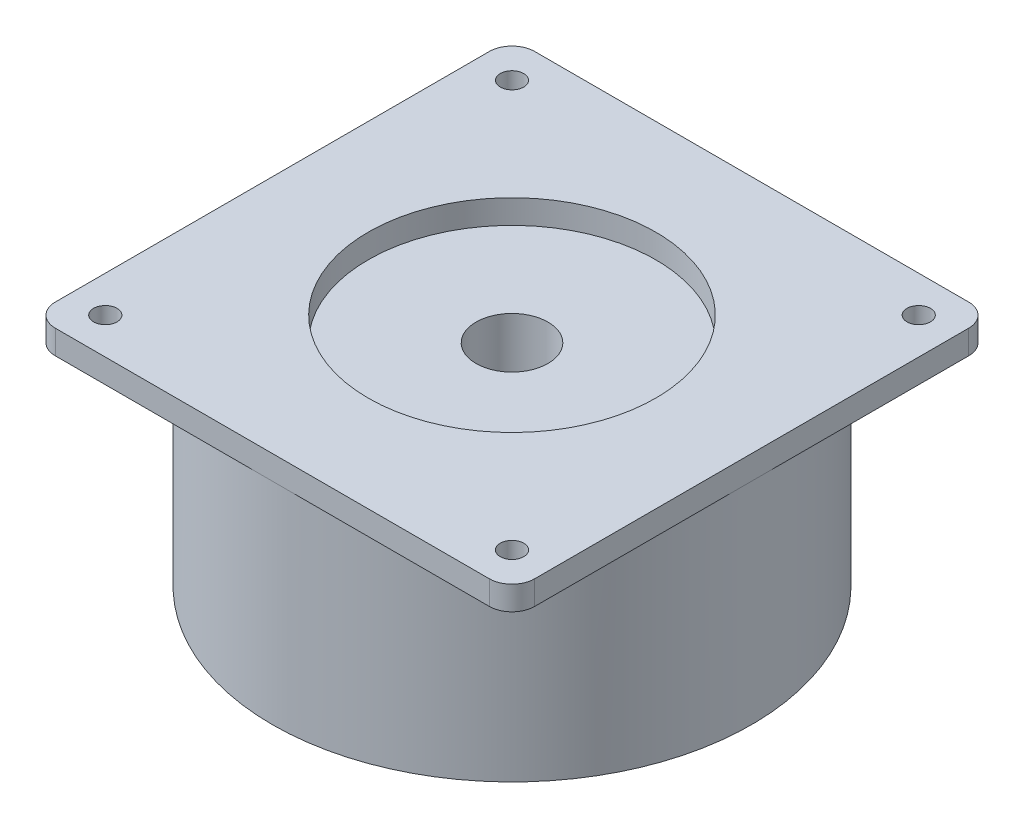
ISO-10303-21;
HEADER;
FILE_DESCRIPTION(('STEP AP214'),'2;1');
FILE_NAME('part.step','',(''),(''),'','','');
FILE_SCHEMA(('AUTOMOTIVE_DESIGN { 1 0 10303 214 1 1 1 1 }'));
ENDSEC;
DATA;
#1=APPLICATION_CONTEXT('core data for automotive mechanical design processes');
#2=APPLICATION_PROTOCOL_DEFINITION('international standard','automotive_design',2000,#1);
#3=PRODUCT_CONTEXT('',#1,'mechanical');
#4=PRODUCT('Part','Part','',(#3));
#5=PRODUCT_RELATED_PRODUCT_CATEGORY('part','',(#4));
#6=PRODUCT_DEFINITION_FORMATION('','',#4);
#7=PRODUCT_DEFINITION_CONTEXT('part definition',#1,'design');
#8=PRODUCT_DEFINITION('design','',#6,#7);
#9=PRODUCT_DEFINITION_SHAPE('','',#8);
#10=(LENGTH_UNIT() NAMED_UNIT(*) SI_UNIT(.MILLI.,.METRE.));
#11=(NAMED_UNIT(*) PLANE_ANGLE_UNIT() SI_UNIT($,.RADIAN.));
#12=(NAMED_UNIT(*) SI_UNIT($,.STERADIAN.) SOLID_ANGLE_UNIT());
#13=UNCERTAINTY_MEASURE_WITH_UNIT(LENGTH_MEASURE(1.E-05),#10,'distance_accuracy_value','');
#14=(GEOMETRIC_REPRESENTATION_CONTEXT(3) GLOBAL_UNCERTAINTY_ASSIGNED_CONTEXT((#13)) GLOBAL_UNIT_ASSIGNED_CONTEXT((#10,
#11,#12)) REPRESENTATION_CONTEXT('',''));
#15=CARTESIAN_POINT('',(0.,0.,0.));
#16=DIRECTION('',(0.,0.,1.));
#17=DIRECTION('',(1.,0.,0.));
#18=AXIS2_PLACEMENT_3D('',#15,#16,#17);
#19=CARTESIAN_POINT('',(0.,0.,0.));
#20=DIRECTION('',(0.,1.,0.));
#21=DIRECTION('',(0.,0.,1.));
#22=AXIS2_PLACEMENT_3D('',#19,#20,#21);
#23=PLANE('',#22);
#24=CARTESIAN_POINT('',(0.,0.,0.));
#25=DIRECTION('',(0.,1.,0.));
#26=DIRECTION('',(0.,0.,1.));
#27=AXIS2_PLACEMENT_3D('',#24,#25,#26);
#28=CIRCLE('',#27,31.75);
#29=CARTESIAN_POINT('',(0.,0.,31.75));
#30=VERTEX_POINT('',#29);
#31=EDGE_CURVE('E36',#30,#30,#28,.T.);
#32=ORIENTED_EDGE('',*,*,#31,.F.);
#33=EDGE_LOOP('',(#32));
#34=FACE_BOUND('',#33,.T.);
#35=CARTESIAN_POINT('',(0.,0.,0.));
#36=DIRECTION('',(0.,1.,0.));
#37=DIRECTION('',(0.,0.,1.));
#38=AXIS2_PLACEMENT_3D('',#35,#36,#37);
#39=CIRCLE('',#38,4.7625);
#40=CARTESIAN_POINT('',(0.,0.,4.7625));
#41=VERTEX_POINT('',#40);
#42=EDGE_CURVE('E135',#41,#41,#39,.T.);
#43=ORIENTED_EDGE('',*,*,#42,.T.);
#44=EDGE_LOOP('',(#43));
#45=FACE_BOUND('',#44,.T.);
#46=ADVANCED_FACE('F32',(#34,#45),#23,.F.);
#47=CARTESIAN_POINT('',(0.,27.94,0.));
#48=DIRECTION('',(0.,-1.,0.));
#49=DIRECTION('',(0.,0.,-1.));
#50=AXIS2_PLACEMENT_3D('',#47,#48,#49);
#51=CYLINDRICAL_SURFACE('',#50,31.75);
#52=CARTESIAN_POINT('',(0.,27.94,0.));
#53=DIRECTION('',(0.,1.,0.));
#54=DIRECTION('',(0.,0.,1.));
#55=AXIS2_PLACEMENT_3D('',#52,#53,#54);
#56=CIRCLE('',#55,31.75);
#57=CARTESIAN_POINT('',(0.,27.94,31.75));
#58=VERTEX_POINT('',#57);
#59=CARTESIAN_POINT('',(31.75,27.94,0.));
#60=VERTEX_POINT('',#59);
#61=EDGE_CURVE('E11',#58,#60,#56,.T.);
#62=ORIENTED_EDGE('',*,*,#61,.F.);
#63=CARTESIAN_POINT('',(-31.75,27.94,0.));
#64=VERTEX_POINT('',#63);
#65=EDGE_CURVE('E42',#64,#58,#56,.T.);
#66=ORIENTED_EDGE('',*,*,#65,.F.);
#67=CARTESIAN_POINT('',(0.,27.94,-31.75));
#68=VERTEX_POINT('',#67);
#69=EDGE_CURVE('E52',#68,#64,#56,.T.);
#70=ORIENTED_EDGE('',*,*,#69,.F.);
#71=EDGE_CURVE('E41',#60,#68,#56,.T.);
#72=ORIENTED_EDGE('',*,*,#71,.F.);
#73=EDGE_LOOP('',(#62,#66,#70,#72));
#74=FACE_BOUND('',#73,.T.);
#75=ORIENTED_EDGE('',*,*,#31,.T.);
#76=EDGE_LOOP('',(#75));
#77=FACE_BOUND('',#76,.T.);
#78=ADVANCED_FACE('F34',(#74,#77),#51,.T.);
#79=CARTESIAN_POINT('',(0.,27.94,0.));
#80=DIRECTION('',(0.,-1.,0.));
#81=DIRECTION('',(0.,0.,-1.));
#82=AXIS2_PLACEMENT_3D('',#79,#80,#81);
#83=CYLINDRICAL_SURFACE('',#82,4.7625);
#84=CARTESIAN_POINT('',(0.,27.94,0.));
#85=DIRECTION('',(0.,1.,0.));
#86=DIRECTION('',(0.,0.,1.));
#87=AXIS2_PLACEMENT_3D('',#84,#85,#86);
#88=CIRCLE('',#87,4.7625);
#89=CARTESIAN_POINT('',(0.,27.94,4.7625));
#90=VERTEX_POINT('',#89);
#91=EDGE_CURVE('E211',#90,#90,#88,.T.);
#92=ORIENTED_EDGE('',*,*,#91,.T.);
#93=EDGE_LOOP('',(#92));
#94=FACE_BOUND('',#93,.T.);
#95=ORIENTED_EDGE('',*,*,#42,.F.);
#96=EDGE_LOOP('',(#95));
#97=FACE_BOUND('',#96,.T.);
#98=ADVANCED_FACE('F276',(#94,#97),#83,.F.);
#99=CARTESIAN_POINT('',(-28.75,27.94,28.75));
#100=DIRECTION('',(0.,1.,0.));
#101=DIRECTION('',(0.,0.,1.));
#102=AXIS2_PLACEMENT_3D('',#99,#100,#101);
#103=PLANE('',#102);
#104=CARTESIAN_POINT('',(26.940768363209,27.94,26.9407683632059));
#105=DIRECTION('',(0.,1.,0.));
#106=DIRECTION('',(0.,0.,1.));
#107=AXIS2_PLACEMENT_3D('',#104,#105,#106);
#108=CIRCLE('',#107,1.55575000000216);
#109=CARTESIAN_POINT('',(26.940768363209,27.94,28.4965183632081));
#110=VERTEX_POINT('',#109);
#111=EDGE_CURVE('E202',#110,#110,#108,.T.);
#112=ORIENTED_EDGE('',*,*,#111,.T.);
#113=EDGE_LOOP('',(#112));
#114=FACE_BOUND('',#113,.T.);
#115=DIRECTION('',(1.,0.,0.));
#116=VECTOR('',#115,1.);
#117=CARTESIAN_POINT('',(-28.75,27.94,31.75));
#118=LINE('',#117,#116);
#119=CARTESIAN_POINT('',(28.75,27.94,31.75));
#120=VERTEX_POINT('',#119);
#121=EDGE_CURVE('E177',#58,#120,#118,.T.);
#122=ORIENTED_EDGE('',*,*,#121,.F.);
#123=ORIENTED_EDGE('',*,*,#61,.T.);
#124=DIRECTION('',(0.,0.,-1.));
#125=VECTOR('',#124,1.);
#126=CARTESIAN_POINT('',(31.75,27.94,-28.75));
#127=LINE('',#126,#125);
#128=CARTESIAN_POINT('',(31.75,27.94,28.75));
#129=VERTEX_POINT('',#128);
#130=EDGE_CURVE('E169',#129,#60,#127,.T.);
#131=ORIENTED_EDGE('',*,*,#130,.F.);
#132=CARTESIAN_POINT('',(28.75,27.94,28.75));
#133=DIRECTION('',(0.,1.,0.));
#134=DIRECTION('',(0.,0.,1.));
#135=AXIS2_PLACEMENT_3D('',#132,#133,#134);
#136=CIRCLE('',#135,3.);
#137=EDGE_CURVE('E173',#120,#129,#136,.T.);
#138=ORIENTED_EDGE('',*,*,#137,.F.);
#139=EDGE_LOOP('',(#122,#123,#131,#138));
#140=FACE_BOUND('',#139,.T.);
#141=ADVANCED_FACE('F278',(#114,#140),#103,.F.);
#142=CARTESIAN_POINT('',(26.9407683632074,27.94,-26.940768363209));
#143=DIRECTION('',(0.,1.,0.));
#144=DIRECTION('',(0.,0.,1.));
#145=AXIS2_PLACEMENT_3D('',#142,#143,#144);
#146=CIRCLE('',#145,1.55575000000159);
#147=CARTESIAN_POINT('',(26.9407683632074,27.94,-25.3850183632074));
#148=VERTEX_POINT('',#147);
#149=EDGE_CURVE('E196',#148,#148,#146,.T.);
#150=ORIENTED_EDGE('',*,*,#149,.T.);
#151=EDGE_LOOP('',(#150));
#152=FACE_BOUND('',#151,.T.);
#153=CARTESIAN_POINT('',(31.75,27.94,-28.75));
#154=VERTEX_POINT('',#153);
#155=EDGE_CURVE('E172',#60,#154,#127,.T.);
#156=ORIENTED_EDGE('',*,*,#155,.F.);
#157=ORIENTED_EDGE('',*,*,#71,.T.);
#158=DIRECTION('',(-1.,0.,0.));
#159=VECTOR('',#158,1.);
#160=CARTESIAN_POINT('',(-28.75,27.94,-31.75));
#161=LINE('',#160,#159);
#162=CARTESIAN_POINT('',(28.75,27.94,-31.75));
#163=VERTEX_POINT('',#162);
#164=EDGE_CURVE('E163',#163,#68,#161,.T.);
#165=ORIENTED_EDGE('',*,*,#164,.F.);
#166=CARTESIAN_POINT('',(28.75,27.94,-28.75));
#167=DIRECTION('',(0.,1.,0.));
#168=DIRECTION('',(0.,0.,1.));
#169=AXIS2_PLACEMENT_3D('',#166,#167,#168);
#170=CIRCLE('',#169,3.);
#171=EDGE_CURVE('E167',#154,#163,#170,.T.);
#172=ORIENTED_EDGE('',*,*,#171,.F.);
#173=EDGE_LOOP('',(#156,#157,#165,#172));
#174=FACE_BOUND('',#173,.T.);
#175=ADVANCED_FACE('F251',(#152,#174),#103,.F.);
#176=CARTESIAN_POINT('',(-26.9407683632075,27.94,-26.9407683632074));
#177=DIRECTION('',(0.,1.,0.));
#178=DIRECTION('',(0.,0.,1.));
#179=AXIS2_PLACEMENT_3D('',#176,#177,#178);
#180=CIRCLE('',#179,1.55575);
#181=CARTESIAN_POINT('',(-26.9407683632075,27.94,-25.3850183632075));
#182=VERTEX_POINT('',#181);
#183=EDGE_CURVE('E190',#182,#182,#180,.T.);
#184=ORIENTED_EDGE('',*,*,#183,.T.);
#185=EDGE_LOOP('',(#184));
#186=FACE_BOUND('',#185,.T.);
#187=CARTESIAN_POINT('',(-28.75,27.94,-31.75));
#188=VERTEX_POINT('',#187);
#189=EDGE_CURVE('E166',#68,#188,#161,.T.);
#190=ORIENTED_EDGE('',*,*,#189,.F.);
#191=ORIENTED_EDGE('',*,*,#69,.T.);
#192=DIRECTION('',(0.,0.,1.));
#193=VECTOR('',#192,1.);
#194=CARTESIAN_POINT('',(-31.75,27.94,-28.75));
#195=LINE('',#194,#193);
#196=CARTESIAN_POINT('',(-31.75,27.94,-28.75));
#197=VERTEX_POINT('',#196);
#198=EDGE_CURVE('E130',#197,#64,#195,.T.);
#199=ORIENTED_EDGE('',*,*,#198,.F.);
#200=CARTESIAN_POINT('',(-28.75,27.94,-28.75));
#201=DIRECTION('',(0.,1.,0.));
#202=DIRECTION('',(0.,0.,-1.));
#203=AXIS2_PLACEMENT_3D('',#200,#201,#202);
#204=CIRCLE('',#203,3.);
#205=EDGE_CURVE('E161',#188,#197,#204,.T.);
#206=ORIENTED_EDGE('',*,*,#205,.F.);
#207=EDGE_LOOP('',(#190,#191,#199,#206));
#208=FACE_BOUND('',#207,.T.);
#209=ADVANCED_FACE('F248',(#186,#208),#103,.F.);
#210=CARTESIAN_POINT('',(-26.9407683632059,27.94,26.9407683632075));
#211=DIRECTION('',(0.,1.,0.));
#212=DIRECTION('',(0.,0.,1.));
#213=AXIS2_PLACEMENT_3D('',#210,#211,#212);
#214=CIRCLE('',#213,1.5557500000008);
#215=CARTESIAN_POINT('',(-26.9407683632059,27.94,28.4965183632083));
#216=VERTEX_POINT('',#215);
#217=EDGE_CURVE('E208',#216,#216,#214,.T.);
#218=ORIENTED_EDGE('',*,*,#217,.T.);
#219=EDGE_LOOP('',(#218));
#220=FACE_BOUND('',#219,.T.);
#221=CARTESIAN_POINT('',(-31.75,27.94,28.75));
#222=VERTEX_POINT('',#221);
#223=EDGE_CURVE('E160',#64,#222,#195,.T.);
#224=ORIENTED_EDGE('',*,*,#223,.F.);
#225=ORIENTED_EDGE('',*,*,#65,.T.);
#226=CARTESIAN_POINT('',(-28.75,27.94,31.75));
#227=VERTEX_POINT('',#226);
#228=EDGE_CURVE('E175',#227,#58,#118,.T.);
#229=ORIENTED_EDGE('',*,*,#228,.F.);
#230=CARTESIAN_POINT('',(-28.75,27.94,28.75));
#231=DIRECTION('',(0.,1.,0.));
#232=DIRECTION('',(0.,0.,1.));
#233=AXIS2_PLACEMENT_3D('',#230,#231,#232);
#234=CIRCLE('',#233,3.);
#235=EDGE_CURVE('E134',#222,#227,#234,.T.);
#236=ORIENTED_EDGE('',*,*,#235,.F.);
#237=EDGE_LOOP('',(#224,#225,#229,#236));
#238=FACE_BOUND('',#237,.T.);
#239=ADVANCED_FACE('F234',(#220,#238),#103,.F.);
#240=CARTESIAN_POINT('',(-28.75,31.115,28.75));
#241=DIRECTION('',(0.,1.,0.));
#242=DIRECTION('',(0.,0.,1.));
#243=AXIS2_PLACEMENT_3D('',#240,#241,#242);
#244=PLANE('',#243);
#245=CARTESIAN_POINT('',(0.,31.115,0.));
#246=DIRECTION('',(0.,1.,0.));
#247=DIRECTION('',(0.,0.,1.));
#248=AXIS2_PLACEMENT_3D('',#245,#246,#247);
#249=CIRCLE('',#248,19.05);
#250=CARTESIAN_POINT('',(0.,31.115,19.05));
#251=VERTEX_POINT('',#250);
#252=EDGE_CURVE('E217',#251,#251,#249,.T.);
#253=ORIENTED_EDGE('',*,*,#252,.F.);
#254=EDGE_LOOP('',(#253));
#255=FACE_BOUND('',#254,.T.);
#256=CARTESIAN_POINT('',(26.940768363209,31.115,26.9407683632059));
#257=DIRECTION('',(0.,1.,0.));
#258=DIRECTION('',(0.,0.,1.));
#259=AXIS2_PLACEMENT_3D('',#256,#257,#258);
#260=CIRCLE('',#259,1.55575000000216);
#261=CARTESIAN_POINT('',(26.940768363209,31.115,28.4965183632081));
#262=VERTEX_POINT('',#261);
#263=EDGE_CURVE('E199',#262,#262,#260,.T.);
#264=ORIENTED_EDGE('',*,*,#263,.F.);
#265=EDGE_LOOP('',(#264));
#266=FACE_BOUND('',#265,.T.);
#267=CARTESIAN_POINT('',(-26.9407683632075,31.115,-26.9407683632074));
#268=DIRECTION('',(0.,1.,0.));
#269=DIRECTION('',(0.,0.,1.));
#270=AXIS2_PLACEMENT_3D('',#267,#268,#269);
#271=CIRCLE('',#270,1.55575);
#272=CARTESIAN_POINT('',(-26.9407683632075,31.115,-25.3850183632075));
#273=VERTEX_POINT('',#272);
#274=EDGE_CURVE('E179',#273,#273,#271,.T.);
#275=ORIENTED_EDGE('',*,*,#274,.F.);
#276=EDGE_LOOP('',(#275));
#277=FACE_BOUND('',#276,.T.);
#278=CARTESIAN_POINT('',(-28.75,31.115,28.75));
#279=DIRECTION('',(0.,1.,0.));
#280=DIRECTION('',(0.,0.,1.));
#281=AXIS2_PLACEMENT_3D('',#278,#279,#280);
#282=CIRCLE('',#281,3.);
#283=CARTESIAN_POINT('',(-31.75,31.115,28.75));
#284=VERTEX_POINT('',#283);
#285=CARTESIAN_POINT('',(-28.75,31.115,31.75));
#286=VERTEX_POINT('',#285);
#287=EDGE_CURVE('E120',#284,#286,#282,.T.);
#288=ORIENTED_EDGE('',*,*,#287,.T.);
#289=DIRECTION('',(1.,0.,0.));
#290=VECTOR('',#289,1.);
#291=CARTESIAN_POINT('',(-28.75,31.115,31.75));
#292=LINE('',#291,#290);
#293=CARTESIAN_POINT('',(28.75,31.115,31.75));
#294=VERTEX_POINT('',#293);
#295=EDGE_CURVE('E108',#286,#294,#292,.T.);
#296=ORIENTED_EDGE('',*,*,#295,.T.);
#297=CARTESIAN_POINT('',(28.75,31.115,28.75));
#298=DIRECTION('',(0.,1.,0.));
#299=DIRECTION('',(0.,0.,1.));
#300=AXIS2_PLACEMENT_3D('',#297,#298,#299);
#301=CIRCLE('',#300,3.);
#302=CARTESIAN_POINT('',(31.75,31.115,28.75));
#303=VERTEX_POINT('',#302);
#304=EDGE_CURVE('E119',#294,#303,#301,.T.);
#305=ORIENTED_EDGE('',*,*,#304,.T.);
#306=DIRECTION('',(0.,0.,-1.));
#307=VECTOR('',#306,1.);
#308=CARTESIAN_POINT('',(31.75,31.115,-28.75));
#309=LINE('',#308,#307);
#310=CARTESIAN_POINT('',(31.75,31.115,-28.75));
#311=VERTEX_POINT('',#310);
#312=EDGE_CURVE('E187',#303,#311,#309,.T.);
#313=ORIENTED_EDGE('',*,*,#312,.T.);
#314=CARTESIAN_POINT('',(28.75,31.115,-28.75));
#315=DIRECTION('',(0.,1.,0.));
#316=DIRECTION('',(0.,0.,1.));
#317=AXIS2_PLACEMENT_3D('',#314,#315,#316);
#318=CIRCLE('',#317,3.);
#319=CARTESIAN_POINT('',(28.75,31.115,-31.75));
#320=VERTEX_POINT('',#319);
#321=EDGE_CURVE('E185',#311,#320,#318,.T.);
#322=ORIENTED_EDGE('',*,*,#321,.T.);
#323=DIRECTION('',(-1.,0.,0.));
#324=VECTOR('',#323,1.);
#325=CARTESIAN_POINT('',(-28.75,31.115,-31.75));
#326=LINE('',#325,#324);
#327=CARTESIAN_POINT('',(-28.75,31.115,-31.75));
#328=VERTEX_POINT('',#327);
#329=EDGE_CURVE('E183',#320,#328,#326,.T.);
#330=ORIENTED_EDGE('',*,*,#329,.T.);
#331=CARTESIAN_POINT('',(-28.75,31.115,-28.75));
#332=DIRECTION('',(0.,1.,0.));
#333=DIRECTION('',(0.,0.,-1.));
#334=AXIS2_PLACEMENT_3D('',#331,#332,#333);
#335=CIRCLE('',#334,3.);
#336=CARTESIAN_POINT('',(-31.75,31.115,-28.75));
#337=VERTEX_POINT('',#336);
#338=EDGE_CURVE('E181',#328,#337,#335,.T.);
#339=ORIENTED_EDGE('',*,*,#338,.T.);
#340=DIRECTION('',(0.,0.,1.));
#341=VECTOR('',#340,1.);
#342=CARTESIAN_POINT('',(-31.75,31.115,-28.75));
#343=LINE('',#342,#341);
#344=EDGE_CURVE('E126',#337,#284,#343,.T.);
#345=ORIENTED_EDGE('',*,*,#344,.T.);
#346=EDGE_LOOP('',(#288,#296,#305,#313,#322,#330,#339,#345));
#347=FACE_BOUND('',#346,.T.);
#348=CARTESIAN_POINT('',(26.9407683632074,31.115,-26.940768363209));
#349=DIRECTION('',(0.,1.,0.));
#350=DIRECTION('',(0.,0.,1.));
#351=AXIS2_PLACEMENT_3D('',#348,#349,#350);
#352=CIRCLE('',#351,1.55575000000159);
#353=CARTESIAN_POINT('',(26.9407683632074,31.115,-25.3850183632074));
#354=VERTEX_POINT('',#353);
#355=EDGE_CURVE('E193',#354,#354,#352,.T.);
#356=ORIENTED_EDGE('',*,*,#355,.F.);
#357=EDGE_LOOP('',(#356));
#358=FACE_BOUND('',#357,.T.);
#359=CARTESIAN_POINT('',(-26.9407683632059,31.115,26.9407683632075));
#360=DIRECTION('',(0.,1.,0.));
#361=DIRECTION('',(0.,0.,1.));
#362=AXIS2_PLACEMENT_3D('',#359,#360,#361);
#363=CIRCLE('',#362,1.5557500000008);
#364=CARTESIAN_POINT('',(-26.9407683632059,31.115,28.4965183632083));
#365=VERTEX_POINT('',#364);
#366=EDGE_CURVE('E205',#365,#365,#363,.T.);
#367=ORIENTED_EDGE('',*,*,#366,.F.);
#368=EDGE_LOOP('',(#367));
#369=FACE_BOUND('',#368,.T.);
#370=ADVANCED_FACE('F123',(#255,#266,#277,#347,#358,#369),#244,.T.);
#371=CARTESIAN_POINT('',(-28.75,31.115,28.75));
#372=DIRECTION('',(0.,-1.,0.));
#373=DIRECTION('',(0.,0.,-1.));
#374=AXIS2_PLACEMENT_3D('',#371,#372,#373);
#375=CYLINDRICAL_SURFACE('',#374,3.);
#376=ORIENTED_EDGE('',*,*,#235,.T.);
#377=DIRECTION('',(0.,-1.,0.));
#378=VECTOR('',#377,1.);
#379=CARTESIAN_POINT('',(-28.75,31.115,31.75));
#380=LINE('',#379,#378);
#381=EDGE_CURVE('E113',#286,#227,#380,.T.);
#382=ORIENTED_EDGE('',*,*,#381,.F.);
#383=ORIENTED_EDGE('',*,*,#287,.F.);
#384=DIRECTION('',(0.,-1.,0.));
#385=VECTOR('',#384,1.);
#386=CARTESIAN_POINT('',(-31.75,31.115,28.75));
#387=LINE('',#386,#385);
#388=EDGE_CURVE('E156',#284,#222,#387,.T.);
#389=ORIENTED_EDGE('',*,*,#388,.T.);
#390=EDGE_LOOP('',(#376,#382,#383,#389));
#391=FACE_BOUND('',#390,.T.);
#392=ADVANCED_FACE('F132',(#391),#375,.T.);
#393=CARTESIAN_POINT('',(-28.75,31.115,31.75));
#394=DIRECTION('',(0.,0.,-1.));
#395=DIRECTION('',(-1.,0.,0.));
#396=AXIS2_PLACEMENT_3D('',#393,#394,#395);
#397=PLANE('',#396);
#398=ORIENTED_EDGE('',*,*,#228,.T.);
#399=ORIENTED_EDGE('',*,*,#121,.T.);
#400=DIRECTION('',(0.,-1.,0.));
#401=VECTOR('',#400,1.);
#402=CARTESIAN_POINT('',(28.75,31.115,31.75));
#403=LINE('',#402,#401);
#404=EDGE_CURVE('E116',#294,#120,#403,.T.);
#405=ORIENTED_EDGE('',*,*,#404,.F.);
#406=ORIENTED_EDGE('',*,*,#295,.F.);
#407=ORIENTED_EDGE('',*,*,#381,.T.);
#408=EDGE_LOOP('',(#398,#399,#405,#406,#407));
#409=FACE_BOUND('',#408,.T.);
#410=ADVANCED_FACE('F111',(#409),#397,.F.);
#411=CARTESIAN_POINT('',(28.75,31.115,28.75));
#412=DIRECTION('',(0.,-1.,0.));
#413=DIRECTION('',(0.,0.,-1.));
#414=AXIS2_PLACEMENT_3D('',#411,#412,#413);
#415=CYLINDRICAL_SURFACE('',#414,3.);
#416=ORIENTED_EDGE('',*,*,#137,.T.);
#417=DIRECTION('',(0.,-1.,0.));
#418=VECTOR('',#417,1.);
#419=CARTESIAN_POINT('',(31.75,31.115,28.75));
#420=LINE('',#419,#418);
#421=EDGE_CURVE('E139',#303,#129,#420,.T.);
#422=ORIENTED_EDGE('',*,*,#421,.F.);
#423=ORIENTED_EDGE('',*,*,#304,.F.);
#424=ORIENTED_EDGE('',*,*,#404,.T.);
#425=EDGE_LOOP('',(#416,#422,#423,#424));
#426=FACE_BOUND('',#425,.T.);
#427=ADVANCED_FACE('F291',(#426),#415,.T.);
#428=CARTESIAN_POINT('',(31.75,31.115,-28.75));
#429=DIRECTION('',(-1.,0.,0.));
#430=DIRECTION('',(0.,0.,1.));
#431=AXIS2_PLACEMENT_3D('',#428,#429,#430);
#432=PLANE('',#431);
#433=ORIENTED_EDGE('',*,*,#130,.T.);
#434=ORIENTED_EDGE('',*,*,#155,.T.);
#435=DIRECTION('',(0.,-1.,0.));
#436=VECTOR('',#435,1.);
#437=CARTESIAN_POINT('',(31.75,31.115,-28.75));
#438=LINE('',#437,#436);
#439=EDGE_CURVE('E144',#311,#154,#438,.T.);
#440=ORIENTED_EDGE('',*,*,#439,.F.);
#441=ORIENTED_EDGE('',*,*,#312,.F.);
#442=ORIENTED_EDGE('',*,*,#421,.T.);
#443=EDGE_LOOP('',(#433,#434,#440,#441,#442));
#444=FACE_BOUND('',#443,.T.);
#445=ADVANCED_FACE('F294',(#444),#432,.F.);
#446=CARTESIAN_POINT('',(28.75,31.115,-28.75));
#447=DIRECTION('',(0.,-1.,0.));
#448=DIRECTION('',(0.,0.,-1.));
#449=AXIS2_PLACEMENT_3D('',#446,#447,#448);
#450=CYLINDRICAL_SURFACE('',#449,3.);
#451=ORIENTED_EDGE('',*,*,#171,.T.);
#452=DIRECTION('',(0.,-1.,0.));
#453=VECTOR('',#452,1.);
#454=CARTESIAN_POINT('',(28.75,31.115,-31.75));
#455=LINE('',#454,#453);
#456=EDGE_CURVE('E147',#320,#163,#455,.T.);
#457=ORIENTED_EDGE('',*,*,#456,.F.);
#458=ORIENTED_EDGE('',*,*,#321,.F.);
#459=ORIENTED_EDGE('',*,*,#439,.T.);
#460=EDGE_LOOP('',(#451,#457,#458,#459));
#461=FACE_BOUND('',#460,.T.);
#462=ADVANCED_FACE('F298',(#461),#450,.T.);
#463=CARTESIAN_POINT('',(-28.75,31.115,-31.75));
#464=DIRECTION('',(0.,0.,1.));
#465=DIRECTION('',(1.,0.,0.));
#466=AXIS2_PLACEMENT_3D('',#463,#464,#465);
#467=PLANE('',#466);
#468=ORIENTED_EDGE('',*,*,#164,.T.);
#469=ORIENTED_EDGE('',*,*,#189,.T.);
#470=DIRECTION('',(0.,-1.,0.));
#471=VECTOR('',#470,1.);
#472=CARTESIAN_POINT('',(-28.75,31.115,-31.75));
#473=LINE('',#472,#471);
#474=EDGE_CURVE('E150',#328,#188,#473,.T.);
#475=ORIENTED_EDGE('',*,*,#474,.F.);
#476=ORIENTED_EDGE('',*,*,#329,.F.);
#477=ORIENTED_EDGE('',*,*,#456,.T.);
#478=EDGE_LOOP('',(#468,#469,#475,#476,#477));
#479=FACE_BOUND('',#478,.T.);
#480=ADVANCED_FACE('F260',(#479),#467,.F.);
#481=CARTESIAN_POINT('',(-28.75,31.115,-28.75));
#482=DIRECTION('',(0.,-1.,0.));
#483=DIRECTION('',(0.,0.,-1.));
#484=AXIS2_PLACEMENT_3D('',#481,#482,#483);
#485=CYLINDRICAL_SURFACE('',#484,3.);
#486=ORIENTED_EDGE('',*,*,#205,.T.);
#487=DIRECTION('',(0.,-1.,0.));
#488=VECTOR('',#487,1.);
#489=CARTESIAN_POINT('',(-31.75,31.115,-28.75));
#490=LINE('',#489,#488);
#491=EDGE_CURVE('E153',#337,#197,#490,.T.);
#492=ORIENTED_EDGE('',*,*,#491,.F.);
#493=ORIENTED_EDGE('',*,*,#338,.F.);
#494=ORIENTED_EDGE('',*,*,#474,.T.);
#495=EDGE_LOOP('',(#486,#492,#493,#494));
#496=FACE_BOUND('',#495,.T.);
#497=ADVANCED_FACE('F305',(#496),#485,.T.);
#498=CARTESIAN_POINT('',(-31.75,31.115,-28.75));
#499=DIRECTION('',(1.,0.,0.));
#500=DIRECTION('',(0.,0.,-1.));
#501=AXIS2_PLACEMENT_3D('',#498,#499,#500);
#502=PLANE('',#501);
#503=ORIENTED_EDGE('',*,*,#198,.T.);
#504=ORIENTED_EDGE('',*,*,#223,.T.);
#505=ORIENTED_EDGE('',*,*,#388,.F.);
#506=ORIENTED_EDGE('',*,*,#344,.F.);
#507=ORIENTED_EDGE('',*,*,#491,.T.);
#508=EDGE_LOOP('',(#503,#504,#505,#506,#507));
#509=FACE_BOUND('',#508,.T.);
#510=ADVANCED_FACE('F244',(#509),#502,.F.);
#511=CARTESIAN_POINT('',(-26.9407683632075,31.115,-26.9407683632074));
#512=DIRECTION('',(0.,-1.,0.));
#513=DIRECTION('',(0.,0.,-1.));
#514=AXIS2_PLACEMENT_3D('',#511,#512,#513);
#515=CYLINDRICAL_SURFACE('',#514,1.55575);
#516=ORIENTED_EDGE('',*,*,#274,.T.);
#517=EDGE_LOOP('',(#516));
#518=FACE_BOUND('',#517,.T.);
#519=ORIENTED_EDGE('',*,*,#183,.F.);
#520=EDGE_LOOP('',(#519));
#521=FACE_BOUND('',#520,.T.);
#522=ADVANCED_FACE('F240',(#518,#521),#515,.F.);
#523=CARTESIAN_POINT('',(26.9407683632074,31.115,-26.940768363209));
#524=DIRECTION('',(0.,-1.,0.));
#525=DIRECTION('',(0.,0.,-1.));
#526=AXIS2_PLACEMENT_3D('',#523,#524,#525);
#527=CYLINDRICAL_SURFACE('',#526,1.55575000000159);
#528=ORIENTED_EDGE('',*,*,#355,.T.);
#529=EDGE_LOOP('',(#528));
#530=FACE_BOUND('',#529,.T.);
#531=ORIENTED_EDGE('',*,*,#149,.F.);
#532=EDGE_LOOP('',(#531));
#533=FACE_BOUND('',#532,.T.);
#534=ADVANCED_FACE('F243',(#530,#533),#527,.F.);
#535=CARTESIAN_POINT('',(26.940768363209,31.115,26.9407683632059));
#536=DIRECTION('',(0.,-1.,0.));
#537=DIRECTION('',(0.,0.,-1.));
#538=AXIS2_PLACEMENT_3D('',#535,#536,#537);
#539=CYLINDRICAL_SURFACE('',#538,1.55575000000216);
#540=ORIENTED_EDGE('',*,*,#263,.T.);
#541=EDGE_LOOP('',(#540));
#542=FACE_BOUND('',#541,.T.);
#543=ORIENTED_EDGE('',*,*,#111,.F.);
#544=EDGE_LOOP('',(#543));
#545=FACE_BOUND('',#544,.T.);
#546=ADVANCED_FACE('F314',(#542,#545),#539,.F.);
#547=CARTESIAN_POINT('',(-26.9407683632059,31.115,26.9407683632075));
#548=DIRECTION('',(0.,-1.,0.));
#549=DIRECTION('',(0.,0.,-1.));
#550=AXIS2_PLACEMENT_3D('',#547,#548,#549);
#551=CYLINDRICAL_SURFACE('',#550,1.5557500000008);
#552=ORIENTED_EDGE('',*,*,#366,.T.);
#553=EDGE_LOOP('',(#552));
#554=FACE_BOUND('',#553,.T.);
#555=ORIENTED_EDGE('',*,*,#217,.F.);
#556=EDGE_LOOP('',(#555));
#557=FACE_BOUND('',#556,.T.);
#558=ADVANCED_FACE('F228',(#554,#557),#551,.F.);
#559=CARTESIAN_POINT('',(0.,27.94,0.));
#560=DIRECTION('',(0.,1.,0.));
#561=DIRECTION('',(0.,0.,1.));
#562=AXIS2_PLACEMENT_3D('',#559,#560,#561);
#563=CYLINDRICAL_SURFACE('',#562,19.05);
#564=CARTESIAN_POINT('',(0.,27.94,0.));
#565=DIRECTION('',(0.,1.,0.));
#566=DIRECTION('',(0.,0.,1.));
#567=AXIS2_PLACEMENT_3D('',#564,#565,#566);
#568=CIRCLE('',#567,19.05);
#569=CARTESIAN_POINT('',(0.,27.94,19.05));
#570=VERTEX_POINT('',#569);
#571=EDGE_CURVE('E216',#570,#570,#568,.T.);
#572=ORIENTED_EDGE('',*,*,#571,.F.);
#573=EDGE_LOOP('',(#572));
#574=FACE_BOUND('',#573,.T.);
#575=ORIENTED_EDGE('',*,*,#252,.T.);
#576=EDGE_LOOP('',(#575));
#577=FACE_BOUND('',#576,.T.);
#578=ADVANCED_FACE('F225',(#574,#577),#563,.F.);
#579=CARTESIAN_POINT('',(0.,27.94,0.));
#580=DIRECTION('',(0.,1.,0.));
#581=DIRECTION('',(0.,0.,1.));
#582=AXIS2_PLACEMENT_3D('',#579,#580,#581);
#583=PLANE('',#582);
#584=ORIENTED_EDGE('',*,*,#91,.F.);
#585=EDGE_LOOP('',(#584));
#586=FACE_BOUND('',#585,.T.);
#587=ORIENTED_EDGE('',*,*,#571,.T.);
#588=EDGE_LOOP('',(#587));
#589=FACE_BOUND('',#588,.T.);
#590=ADVANCED_FACE('F223',(#586,#589),#583,.T.);
#591=CLOSED_SHELL('',(#46,#78,#98,#141,#175,#209,#239,#370,#392,#410,#427,#445,#462,#480,#497,
#510,#522,#534,#546,#558,#578,#590));
#592=MANIFOLD_SOLID_BREP('B2',#591);
#593=ADVANCED_BREP_SHAPE_REPRESENTATION('',(#18,#592),#14);
#594=SHAPE_DEFINITION_REPRESENTATION(#9,#593);
ENDSEC;
END-ISO-10303-21;
